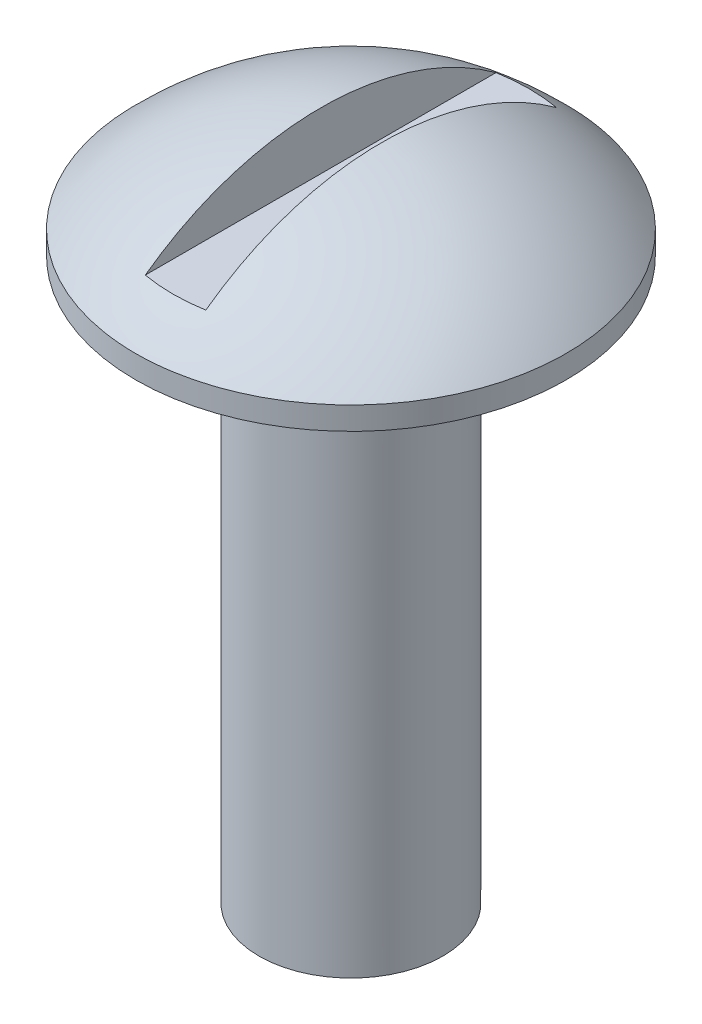
ISO-10303-21;
HEADER;
FILE_DESCRIPTION(('STEP AP214'),'2;1');
FILE_NAME('part.step','',(''),(''),'','','');
FILE_SCHEMA(('AUTOMOTIVE_DESIGN { 1 0 10303 214 1 1 1 1 }'));
ENDSEC;
DATA;
#1=APPLICATION_CONTEXT('core data for automotive mechanical design processes');
#2=APPLICATION_PROTOCOL_DEFINITION('international standard','automotive_design',2000,#1);
#3=PRODUCT_CONTEXT('',#1,'mechanical');
#4=PRODUCT('Part','Part','',(#3));
#5=PRODUCT_RELATED_PRODUCT_CATEGORY('part','',(#4));
#6=PRODUCT_DEFINITION_FORMATION('','',#4);
#7=PRODUCT_DEFINITION_CONTEXT('part definition',#1,'design');
#8=PRODUCT_DEFINITION('design','',#6,#7);
#9=PRODUCT_DEFINITION_SHAPE('','',#8);
#10=(LENGTH_UNIT() NAMED_UNIT(*) SI_UNIT(.MILLI.,.METRE.));
#11=(NAMED_UNIT(*) PLANE_ANGLE_UNIT() SI_UNIT($,.RADIAN.));
#12=(NAMED_UNIT(*) SI_UNIT($,.STERADIAN.) SOLID_ANGLE_UNIT());
#13=UNCERTAINTY_MEASURE_WITH_UNIT(LENGTH_MEASURE(1.E-05),#10,'distance_accuracy_value','');
#14=(GEOMETRIC_REPRESENTATION_CONTEXT(3) GLOBAL_UNCERTAINTY_ASSIGNED_CONTEXT((#13)) GLOBAL_UNIT_ASSIGNED_CONTEXT((#10,
#11,#12)) REPRESENTATION_CONTEXT('',''));
#15=CARTESIAN_POINT('',(0.,0.,0.));
#16=DIRECTION('',(0.,0.,1.));
#17=DIRECTION('',(1.,0.,0.));
#18=AXIS2_PLACEMENT_3D('',#15,#16,#17);
#19=CARTESIAN_POINT('',(0.,-4.18293176470588,0.));
#20=DIRECTION('',(0.,0.,1.));
#21=DIRECTION('',(1.,0.,0.));
#22=AXIS2_PLACEMENT_3D('',#19,#20,#21);
#23=SPHERICAL_SURFACE('',#22,6.77373176470588);
#24=CARTESIAN_POINT('',(0.,0.51816,0.));
#25=DIRECTION('',(0.,1.,0.));
#26=DIRECTION('',(0.,0.,1.));
#27=AXIS2_PLACEMENT_3D('',#24,#25,#26);
#28=CIRCLE('',#27,4.8768);
#29=CARTESIAN_POINT('',(0.,0.51816,4.8768));
#30=VERTEX_POINT('',#29);
#31=EDGE_CURVE('E78',#30,#30,#28,.T.);
#32=ORIENTED_EDGE('',*,*,#31,.T.);
#33=EDGE_LOOP('',(#32));
#34=FACE_BOUND('',#33,.T.);
#35=CARTESIAN_POINT('',(0.6858,-4.18293176470588,0.));
#36=DIRECTION('',(1.,0.,0.));
#37=DIRECTION('',(0.,1.,0.));
#38=AXIS2_PLACEMENT_3D('',#35,#36,#37);
#39=CIRCLE('',#38,6.73892575861951);
#40=CARTESIAN_POINT('',(0.6858,1.26059399391362,3.97254926910056));
#41=VERTEX_POINT('',#40);
#42=CARTESIAN_POINT('',(0.6858,1.26059399391362,-3.97254926910056));
#43=VERTEX_POINT('',#42);
#44=EDGE_CURVE('E54',#41,#43,#39,.F.);
#45=ORIENTED_EDGE('',*,*,#44,.F.);
#46=CARTESIAN_POINT('',(0.,1.26059399391362,0.));
#47=DIRECTION('',(0.,1.,0.));
#48=DIRECTION('',(0.,0.,1.));
#49=AXIS2_PLACEMENT_3D('',#46,#47,#48);
#50=CIRCLE('',#49,4.03131111865996);
#51=CARTESIAN_POINT('',(-0.6858,1.26059399391362,3.97254926910056));
#52=VERTEX_POINT('',#51);
#53=EDGE_CURVE('E66',#41,#52,#50,.F.);
#54=ORIENTED_EDGE('',*,*,#53,.T.);
#55=CARTESIAN_POINT('',(-0.685799999999998,-4.18293176470588,0.));
#56=DIRECTION('',(-1.,0.,0.));
#57=DIRECTION('',(0.,-1.,0.));
#58=AXIS2_PLACEMENT_3D('',#55,#56,#57);
#59=CIRCLE('',#58,6.73892575861951);
#60=CARTESIAN_POINT('',(-0.6858,1.26059399391362,-3.97254926910056));
#61=VERTEX_POINT('',#60);
#62=EDGE_CURVE('E11',#61,#52,#59,.F.);
#63=ORIENTED_EDGE('',*,*,#62,.F.);
#64=CARTESIAN_POINT('',(0.,1.26059399391362,0.));
#65=DIRECTION('',(0.,-1.,0.));
#66=DIRECTION('',(0.,0.,-1.));
#67=AXIS2_PLACEMENT_3D('',#64,#65,#66);
#68=CIRCLE('',#67,4.03131111865996);
#69=EDGE_CURVE('E41',#43,#61,#68,.F.);
#70=ORIENTED_EDGE('',*,*,#69,.F.);
#71=EDGE_LOOP('',(#45,#54,#63,#70));
#72=FACE_BOUND('',#71,.T.);
#73=ADVANCED_FACE('F34',(#34,#72),#23,.T.);
#74=CARTESIAN_POINT('',(0.,0.,0.));
#75=DIRECTION('',(0.,1.,0.));
#76=DIRECTION('',(0.,0.,1.));
#77=AXIS2_PLACEMENT_3D('',#74,#75,#76);
#78=PLANE('',#77);
#79=CARTESIAN_POINT('',(0.,0.,0.));
#80=DIRECTION('',(0.,1.,0.));
#81=DIRECTION('',(0.,0.,1.));
#82=AXIS2_PLACEMENT_3D('',#79,#80,#81);
#83=CIRCLE('',#82,4.8768);
#84=CARTESIAN_POINT('',(0.,0.,4.8768));
#85=VERTEX_POINT('',#84);
#86=EDGE_CURVE('E75',#85,#85,#83,.T.);
#87=ORIENTED_EDGE('',*,*,#86,.F.);
#88=EDGE_LOOP('',(#87));
#89=FACE_BOUND('',#88,.T.);
#90=CARTESIAN_POINT('',(0.,0.,0.));
#91=DIRECTION('',(0.,1.,0.));
#92=DIRECTION('',(0.,0.,1.));
#93=AXIS2_PLACEMENT_3D('',#90,#91,#92);
#94=CIRCLE('',#93,2.0828);
#95=CARTESIAN_POINT('',(0.,0.,2.0828));
#96=VERTEX_POINT('',#95);
#97=EDGE_CURVE('E81',#96,#96,#94,.F.);
#98=ORIENTED_EDGE('',*,*,#97,.F.);
#99=EDGE_LOOP('',(#98));
#100=FACE_BOUND('',#99,.T.);
#101=ADVANCED_FACE('F88',(#89,#100),#78,.F.);
#102=CARTESIAN_POINT('',(0.,0.51816,0.));
#103=DIRECTION('',(0.,-1.,0.));
#104=DIRECTION('',(0.,0.,-1.));
#105=AXIS2_PLACEMENT_3D('',#102,#103,#104);
#106=CYLINDRICAL_SURFACE('',#105,4.8768);
#107=ORIENTED_EDGE('',*,*,#31,.F.);
#108=EDGE_LOOP('',(#107));
#109=FACE_BOUND('',#108,.T.);
#110=ORIENTED_EDGE('',*,*,#86,.T.);
#111=EDGE_LOOP('',(#110));
#112=FACE_BOUND('',#111,.T.);
#113=ADVANCED_FACE('F90',(#109,#112),#106,.T.);
#114=CARTESIAN_POINT('',(0.,-12.7,0.));
#115=DIRECTION('',(0.,1.,0.));
#116=DIRECTION('',(0.,0.,1.));
#117=AXIS2_PLACEMENT_3D('',#114,#115,#116);
#118=CYLINDRICAL_SURFACE('',#117,2.0828);
#119=CARTESIAN_POINT('',(0.,-12.7,0.));
#120=DIRECTION('',(0.,-1.,0.));
#121=DIRECTION('',(0.,0.,-1.));
#122=AXIS2_PLACEMENT_3D('',#119,#120,#121);
#123=CIRCLE('',#122,2.0828);
#124=CARTESIAN_POINT('',(0.,-12.7,-2.0828));
#125=VERTEX_POINT('',#124);
#126=EDGE_CURVE('E67',#125,#125,#123,.T.);
#127=ORIENTED_EDGE('',*,*,#126,.F.);
#128=EDGE_LOOP('',(#127));
#129=FACE_BOUND('',#128,.T.);
#130=ORIENTED_EDGE('',*,*,#97,.T.);
#131=EDGE_LOOP('',(#130));
#132=FACE_BOUND('',#131,.T.);
#133=ADVANCED_FACE('F86',(#129,#132),#118,.T.);
#134=CARTESIAN_POINT('',(0.,-12.7,0.));
#135=DIRECTION('',(0.,-1.,0.));
#136=DIRECTION('',(0.,0.,-1.));
#137=AXIS2_PLACEMENT_3D('',#134,#135,#136);
#138=PLANE('',#137);
#139=ORIENTED_EDGE('',*,*,#126,.T.);
#140=EDGE_LOOP('',(#139));
#141=FACE_BOUND('',#140,.T.);
#142=ADVANCED_FACE('F103',(#141),#138,.T.);
#143=CARTESIAN_POINT('',(-0.6858,1.26059399391362,-4.8768));
#144=DIRECTION('',(0.,-1.,0.));
#145=DIRECTION('',(0.,0.,-1.));
#146=AXIS2_PLACEMENT_3D('',#143,#144,#145);
#147=PLANE('',#146);
#148=ORIENTED_EDGE('',*,*,#69,.T.);
#149=DIRECTION('',(0.,0.,1.));
#150=VECTOR('',#149,1.);
#151=CARTESIAN_POINT('',(-0.6858,1.26059399391362,-4.8768));
#152=LINE('',#151,#150);
#153=EDGE_CURVE('E61',#61,#52,#152,.T.);
#154=ORIENTED_EDGE('',*,*,#153,.T.);
#155=ORIENTED_EDGE('',*,*,#53,.F.);
#156=DIRECTION('',(0.,0.,1.));
#157=VECTOR('',#156,1.);
#158=CARTESIAN_POINT('',(0.6858,1.26059399391362,-4.8768));
#159=LINE('',#158,#157);
#160=EDGE_CURVE('E68',#43,#41,#159,.T.);
#161=ORIENTED_EDGE('',*,*,#160,.F.);
#162=EDGE_LOOP('',(#148,#154,#155,#161));
#163=FACE_BOUND('',#162,.T.);
#164=ADVANCED_FACE('F65',(#163),#147,.F.);
#165=CARTESIAN_POINT('',(-0.685800000000001,2.55599399391362,-4.8768));
#166=DIRECTION('',(-1.,0.,0.));
#167=DIRECTION('',(0.,-1.,0.));
#168=AXIS2_PLACEMENT_3D('',#165,#166,#167);
#169=PLANE('',#168);
#170=ORIENTED_EDGE('',*,*,#62,.T.);
#171=ORIENTED_EDGE('',*,*,#153,.F.);
#172=EDGE_LOOP('',(#170,#171));
#173=FACE_BOUND('',#172,.T.);
#174=ADVANCED_FACE('F60',(#173),#169,.F.);
#175=CARTESIAN_POINT('',(0.6858,2.55599399391362,-4.8768));
#176=DIRECTION('',(1.,0.,0.));
#177=DIRECTION('',(0.,1.,0.));
#178=AXIS2_PLACEMENT_3D('',#175,#176,#177);
#179=PLANE('',#178);
#180=ORIENTED_EDGE('',*,*,#44,.T.);
#181=ORIENTED_EDGE('',*,*,#160,.T.);
#182=EDGE_LOOP('',(#180,#181));
#183=FACE_BOUND('',#182,.T.);
#184=ADVANCED_FACE('F110',(#183),#179,.F.);
#185=CLOSED_SHELL('',(#73,#101,#113,#133,#142,#164,#174,#184));
#186=MANIFOLD_SOLID_BREP('B2',#185);
#187=ADVANCED_BREP_SHAPE_REPRESENTATION('',(#18,#186),#14);
#188=SHAPE_DEFINITION_REPRESENTATION(#9,#187);
ENDSEC;
END-ISO-10303-21;
